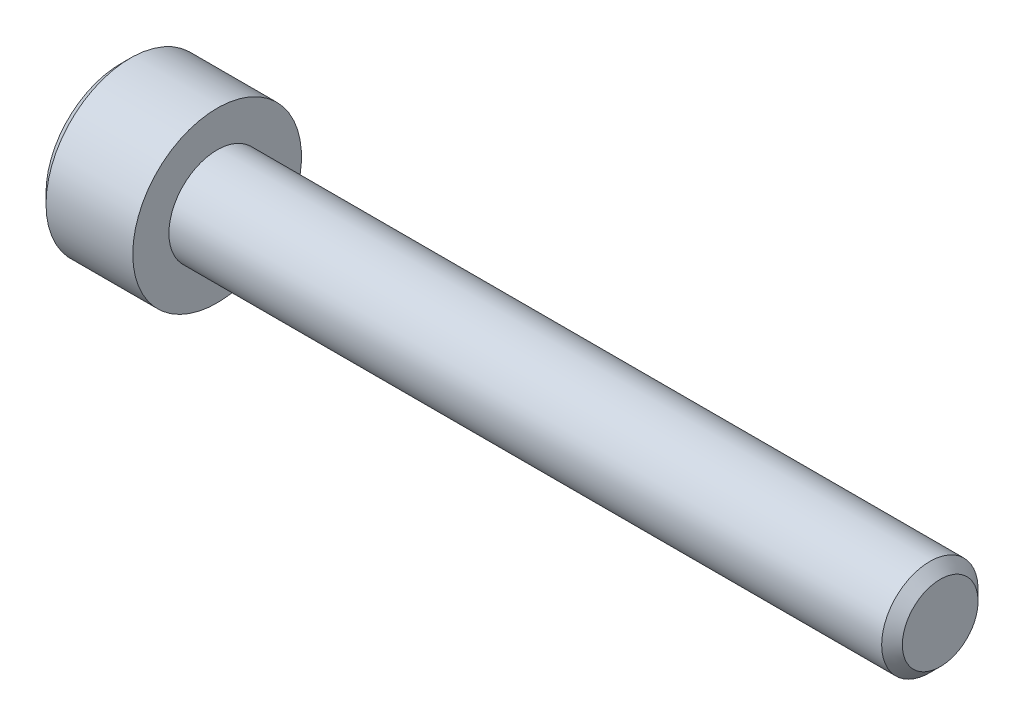
ISO-10303-21;
HEADER;
FILE_DESCRIPTION(('STEP AP214'),'2;1');
FILE_NAME('part.step','',(''),(''),'','','');
FILE_SCHEMA(('AUTOMOTIVE_DESIGN { 1 0 10303 214 1 1 1 1 }'));
ENDSEC;
DATA;
#1=APPLICATION_CONTEXT('core data for automotive mechanical design processes');
#2=APPLICATION_PROTOCOL_DEFINITION('international standard','automotive_design',2000,#1);
#3=PRODUCT_CONTEXT('',#1,'mechanical');
#4=PRODUCT('Part','Part','',(#3));
#5=PRODUCT_RELATED_PRODUCT_CATEGORY('part','',(#4));
#6=PRODUCT_DEFINITION_FORMATION('','',#4);
#7=PRODUCT_DEFINITION_CONTEXT('part definition',#1,'design');
#8=PRODUCT_DEFINITION('design','',#6,#7);
#9=PRODUCT_DEFINITION_SHAPE('','',#8);
#10=(LENGTH_UNIT() NAMED_UNIT(*) SI_UNIT(.MILLI.,.METRE.));
#11=(NAMED_UNIT(*) PLANE_ANGLE_UNIT() SI_UNIT($,.RADIAN.));
#12=(NAMED_UNIT(*) SI_UNIT($,.STERADIAN.) SOLID_ANGLE_UNIT());
#13=UNCERTAINTY_MEASURE_WITH_UNIT(LENGTH_MEASURE(1.E-05),#10,'distance_accuracy_value','');
#14=(GEOMETRIC_REPRESENTATION_CONTEXT(3) GLOBAL_UNCERTAINTY_ASSIGNED_CONTEXT((#13)) GLOBAL_UNIT_ASSIGNED_CONTEXT((#10,
#11,#12)) REPRESENTATION_CONTEXT('',''));
#15=CARTESIAN_POINT('',(0.,0.,0.));
#16=DIRECTION('',(0.,0.,1.));
#17=DIRECTION('',(1.,0.,0.));
#18=AXIS2_PLACEMENT_3D('',#15,#16,#17);
#19=CARTESIAN_POINT('',(-4.,-3.10000000000001,0.));
#20=DIRECTION('',(-1.,0.,0.));
#21=DIRECTION('',(0.,0.,1.));
#22=AXIS2_PLACEMENT_3D('',#19,#20,#21);
#23=PLANE('',#22);
#24=DIRECTION('',(0.,0.5,-0.866025403784439));
#25=VECTOR('',#24,1.);
#26=CARTESIAN_POINT('',(-4.,0.866025403784439,1.5));
#27=LINE('',#26,#25);
#28=CARTESIAN_POINT('',(-4.,0.866025403784439,1.5));
#29=VERTEX_POINT('',#28);
#30=CARTESIAN_POINT('',(-4.,1.73205080756888,0.));
#31=VERTEX_POINT('',#30);
#32=EDGE_CURVE('E59',#29,#31,#27,.T.);
#33=ORIENTED_EDGE('',*,*,#32,.F.);
#34=DIRECTION('',(0.,1.,0.));
#35=VECTOR('',#34,1.);
#36=CARTESIAN_POINT('',(-4.,-0.86602540378444,1.5));
#37=LINE('',#36,#35);
#38=CARTESIAN_POINT('',(-4.,-0.86602540378444,1.5));
#39=VERTEX_POINT('',#38);
#40=EDGE_CURVE('E142',#39,#29,#37,.T.);
#41=ORIENTED_EDGE('',*,*,#40,.F.);
#42=DIRECTION('',(0.,0.5,0.866025403784439));
#43=VECTOR('',#42,1.);
#44=CARTESIAN_POINT('',(-4.,-1.73205080756888,0.));
#45=LINE('',#44,#43);
#46=CARTESIAN_POINT('',(-4.,-1.73205080756888,0.));
#47=VERTEX_POINT('',#46);
#48=EDGE_CURVE('E140',#47,#39,#45,.T.);
#49=ORIENTED_EDGE('',*,*,#48,.F.);
#50=DIRECTION('',(0.,-0.5,0.866025403784439));
#51=VECTOR('',#50,1.);
#52=CARTESIAN_POINT('',(-4.,-0.866025403784439,-1.5));
#53=LINE('',#52,#51);
#54=CARTESIAN_POINT('',(-4.,-0.866025403784439,-1.5));
#55=VERTEX_POINT('',#54);
#56=EDGE_CURVE('E107',#55,#47,#53,.T.);
#57=ORIENTED_EDGE('',*,*,#56,.F.);
#58=DIRECTION('',(0.,-1.,0.));
#59=VECTOR('',#58,1.);
#60=CARTESIAN_POINT('',(-4.,0.866025403784439,-1.5));
#61=LINE('',#60,#59);
#62=CARTESIAN_POINT('',(-4.,0.866025403784439,-1.5));
#63=VERTEX_POINT('',#62);
#64=EDGE_CURVE('E136',#63,#55,#61,.T.);
#65=ORIENTED_EDGE('',*,*,#64,.F.);
#66=DIRECTION('',(0.,-0.5,-0.866025403784439));
#67=VECTOR('',#66,1.);
#68=CARTESIAN_POINT('',(-4.,1.73205080756888,0.));
#69=LINE('',#68,#67);
#70=EDGE_CURVE('E133',#31,#63,#69,.T.);
#71=ORIENTED_EDGE('',*,*,#70,.F.);
#72=EDGE_LOOP('',(#33,#41,#49,#57,#65,#71));
#73=FACE_BOUND('',#72,.T.);
#74=CARTESIAN_POINT('',(-4.,0.,0.));
#75=DIRECTION('',(-1.,0.,0.));
#76=DIRECTION('',(0.,0.,1.));
#77=AXIS2_PLACEMENT_3D('',#74,#75,#76);
#78=CIRCLE('',#77,3.10000000000001);
#79=CARTESIAN_POINT('',(-4.,0.,3.10000000000001));
#80=VERTEX_POINT('',#79);
#81=EDGE_CURVE('E146',#80,#80,#78,.T.);
#82=ORIENTED_EDGE('',*,*,#81,.T.);
#83=EDGE_LOOP('',(#82));
#84=FACE_BOUND('',#83,.T.);
#85=ADVANCED_FACE('F45',(#73,#84),#23,.T.);
#86=CARTESIAN_POINT('',(30.,0.,0.));
#87=DIRECTION('',(1.,0.,0.));
#88=DIRECTION('',(0.,0.,-1.));
#89=AXIS2_PLACEMENT_3D('',#86,#87,#88);
#90=PLANE('',#89);
#91=CARTESIAN_POINT('',(30.,0.,0.));
#92=DIRECTION('',(-1.,0.,0.));
#93=DIRECTION('',(0.,0.,1.));
#94=AXIS2_PLACEMENT_3D('',#91,#92,#93);
#95=CIRCLE('',#94,1.5705);
#96=CARTESIAN_POINT('',(30.,0.,1.5705));
#97=VERTEX_POINT('',#96);
#98=EDGE_CURVE('E11',#97,#97,#95,.T.);
#99=ORIENTED_EDGE('',*,*,#98,.F.);
#100=EDGE_LOOP('',(#99));
#101=FACE_BOUND('',#100,.T.);
#102=ADVANCED_FACE('F170',(#101),#90,.T.);
#103=CARTESIAN_POINT('',(29.5705,0.,0.));
#104=DIRECTION('',(-1.,0.,0.));
#105=DIRECTION('',(0.,0.,1.));
#106=AXIS2_PLACEMENT_3D('',#103,#104,#105);
#107=CONICAL_SURFACE('',#106,2.,0.785398163397457);
#108=ORIENTED_EDGE('',*,*,#98,.T.);
#109=EDGE_LOOP('',(#108));
#110=FACE_BOUND('',#109,.T.);
#111=CARTESIAN_POINT('',(29.5705,0.,0.));
#112=DIRECTION('',(-1.,0.,0.));
#113=DIRECTION('',(0.,0.,1.));
#114=AXIS2_PLACEMENT_3D('',#111,#112,#113);
#115=CIRCLE('',#114,2.);
#116=CARTESIAN_POINT('',(29.5705,0.,2.));
#117=VERTEX_POINT('',#116);
#118=EDGE_CURVE('E52',#117,#117,#115,.T.);
#119=ORIENTED_EDGE('',*,*,#118,.F.);
#120=EDGE_LOOP('',(#119));
#121=FACE_BOUND('',#120,.T.);
#122=ADVANCED_FACE('F168',(#110,#121),#107,.T.);
#123=CARTESIAN_POINT('',(-5.7,0.,0.));
#124=DIRECTION('',(-1.,0.,0.));
#125=DIRECTION('',(0.,0.,1.));
#126=AXIS2_PLACEMENT_3D('',#123,#124,#125);
#127=CYLINDRICAL_SURFACE('',#126,2.);
#128=ORIENTED_EDGE('',*,*,#118,.T.);
#129=EDGE_LOOP('',(#128));
#130=FACE_BOUND('',#129,.T.);
#131=CARTESIAN_POINT('',(0.,0.,0.));
#132=DIRECTION('',(-1.,0.,0.));
#133=DIRECTION('',(0.,0.,1.));
#134=AXIS2_PLACEMENT_3D('',#131,#132,#133);
#135=CIRCLE('',#134,2.);
#136=CARTESIAN_POINT('',(0.,0.,2.));
#137=VERTEX_POINT('',#136);
#138=EDGE_CURVE('E160',#137,#137,#135,.T.);
#139=ORIENTED_EDGE('',*,*,#138,.F.);
#140=EDGE_LOOP('',(#139));
#141=FACE_BOUND('',#140,.T.);
#142=ADVANCED_FACE('F165',(#130,#141),#127,.T.);
#143=CARTESIAN_POINT('',(0.,-2.,0.));
#144=DIRECTION('',(1.,0.,0.));
#145=DIRECTION('',(0.,0.,-1.));
#146=AXIS2_PLACEMENT_3D('',#143,#144,#145);
#147=PLANE('',#146);
#148=ORIENTED_EDGE('',*,*,#138,.T.);
#149=EDGE_LOOP('',(#148));
#150=FACE_BOUND('',#149,.T.);
#151=CARTESIAN_POINT('',(0.,0.,0.));
#152=DIRECTION('',(-1.,0.,0.));
#153=DIRECTION('',(0.,0.,1.));
#154=AXIS2_PLACEMENT_3D('',#151,#152,#153);
#155=CIRCLE('',#154,3.5);
#156=CARTESIAN_POINT('',(0.,0.,3.5));
#157=VERTEX_POINT('',#156);
#158=EDGE_CURVE('E157',#157,#157,#155,.T.);
#159=ORIENTED_EDGE('',*,*,#158,.F.);
#160=EDGE_LOOP('',(#159));
#161=FACE_BOUND('',#160,.T.);
#162=ADVANCED_FACE('F178',(#150,#161),#147,.T.);
#163=CARTESIAN_POINT('',(-5.7,0.,0.));
#164=DIRECTION('',(-1.,0.,0.));
#165=DIRECTION('',(0.,0.,1.));
#166=AXIS2_PLACEMENT_3D('',#163,#164,#165);
#167=CYLINDRICAL_SURFACE('',#166,3.5);
#168=ORIENTED_EDGE('',*,*,#158,.T.);
#169=EDGE_LOOP('',(#168));
#170=FACE_BOUND('',#169,.T.);
#171=CARTESIAN_POINT('',(-3.6,0.,0.));
#172=DIRECTION('',(-1.,0.,0.));
#173=DIRECTION('',(0.,0.,1.));
#174=AXIS2_PLACEMENT_3D('',#171,#172,#173);
#175=CIRCLE('',#174,3.5);
#176=CARTESIAN_POINT('',(-3.6,0.,3.5));
#177=VERTEX_POINT('',#176);
#178=EDGE_CURVE('E154',#177,#177,#175,.T.);
#179=ORIENTED_EDGE('',*,*,#178,.F.);
#180=EDGE_LOOP('',(#179));
#181=FACE_BOUND('',#180,.T.);
#182=ADVANCED_FACE('F194',(#170,#181),#167,.T.);
#183=CARTESIAN_POINT('',(-4.,0.,0.));
#184=DIRECTION('',(1.,0.,0.));
#185=DIRECTION('',(0.,0.,-1.));
#186=AXIS2_PLACEMENT_3D('',#183,#184,#185);
#187=CONICAL_SURFACE('',#186,3.10000000000001,0.785398163397443);
#188=ORIENTED_EDGE('',*,*,#178,.T.);
#189=EDGE_LOOP('',(#188));
#190=FACE_BOUND('',#189,.T.);
#191=ORIENTED_EDGE('',*,*,#81,.F.);
#192=EDGE_LOOP('',(#191));
#193=FACE_BOUND('',#192,.T.);
#194=ADVANCED_FACE('F192',(#190,#193),#187,.T.);
#195=CARTESIAN_POINT('',(-2.,0.866025403784439,1.5));
#196=DIRECTION('',(0.,0.866025403784439,0.5));
#197=DIRECTION('',(0.,-0.5,0.866025403784439));
#198=AXIS2_PLACEMENT_3D('',#195,#196,#197);
#199=PLANE('',#198);
#200=ORIENTED_EDGE('',*,*,#32,.T.);
#201=DIRECTION('',(-1.,0.,0.));
#202=VECTOR('',#201,1.);
#203=CARTESIAN_POINT('',(-2.,1.73205080756888,0.));
#204=LINE('',#203,#202);
#205=CARTESIAN_POINT('',(-2.,1.73205080756888,0.));
#206=VERTEX_POINT('',#205);
#207=EDGE_CURVE('E89',#206,#31,#204,.T.);
#208=ORIENTED_EDGE('',*,*,#207,.F.);
#209=DIRECTION('',(0.,0.5,-0.866025403784439));
#210=VECTOR('',#209,1.);
#211=CARTESIAN_POINT('',(-2.,0.866025403784439,1.5));
#212=LINE('',#211,#210);
#213=CARTESIAN_POINT('',(-2.,0.866025403784439,1.5));
#214=VERTEX_POINT('',#213);
#215=EDGE_CURVE('E144',#214,#206,#212,.T.);
#216=ORIENTED_EDGE('',*,*,#215,.F.);
#217=DIRECTION('',(-1.,0.,0.));
#218=VECTOR('',#217,1.);
#219=CARTESIAN_POINT('',(-2.,0.866025403784439,1.5));
#220=LINE('',#219,#218);
#221=EDGE_CURVE('E67',#214,#29,#220,.T.);
#222=ORIENTED_EDGE('',*,*,#221,.T.);
#223=EDGE_LOOP('',(#200,#208,#216,#222));
#224=FACE_BOUND('',#223,.T.);
#225=ADVANCED_FACE('F193',(#224),#199,.F.);
#226=CARTESIAN_POINT('',(-2.,-0.86602540378444,1.5));
#227=DIRECTION('',(0.,0.,1.));
#228=DIRECTION('',(0.,-1.,0.));
#229=AXIS2_PLACEMENT_3D('',#226,#227,#228);
#230=PLANE('',#229);
#231=ORIENTED_EDGE('',*,*,#40,.T.);
#232=ORIENTED_EDGE('',*,*,#221,.F.);
#233=DIRECTION('',(0.,1.,0.));
#234=VECTOR('',#233,1.);
#235=CARTESIAN_POINT('',(-2.,-0.86602540378444,1.5));
#236=LINE('',#235,#234);
#237=CARTESIAN_POINT('',(-2.,-0.86602540378444,1.5));
#238=VERTEX_POINT('',#237);
#239=EDGE_CURVE('E119',#238,#214,#236,.T.);
#240=ORIENTED_EDGE('',*,*,#239,.F.);
#241=DIRECTION('',(-1.,0.,0.));
#242=VECTOR('',#241,1.);
#243=CARTESIAN_POINT('',(-2.,-0.86602540378444,1.5));
#244=LINE('',#243,#242);
#245=EDGE_CURVE('E111',#238,#39,#244,.T.);
#246=ORIENTED_EDGE('',*,*,#245,.T.);
#247=EDGE_LOOP('',(#231,#232,#240,#246));
#248=FACE_BOUND('',#247,.T.);
#249=ADVANCED_FACE('F200',(#248),#230,.F.);
#250=CARTESIAN_POINT('',(-2.,-1.73205080756888,0.));
#251=DIRECTION('',(0.,-0.866025403784439,0.5));
#252=DIRECTION('',(0.,-0.5,-0.866025403784439));
#253=AXIS2_PLACEMENT_3D('',#250,#251,#252);
#254=PLANE('',#253);
#255=ORIENTED_EDGE('',*,*,#48,.T.);
#256=ORIENTED_EDGE('',*,*,#245,.F.);
#257=DIRECTION('',(0.,0.5,0.866025403784439));
#258=VECTOR('',#257,1.);
#259=CARTESIAN_POINT('',(-2.,-1.73205080756888,0.));
#260=LINE('',#259,#258);
#261=CARTESIAN_POINT('',(-2.,-1.73205080756888,0.));
#262=VERTEX_POINT('',#261);
#263=EDGE_CURVE('E115',#262,#238,#260,.T.);
#264=ORIENTED_EDGE('',*,*,#263,.F.);
#265=DIRECTION('',(-1.,0.,0.));
#266=VECTOR('',#265,1.);
#267=CARTESIAN_POINT('',(-2.,-1.73205080756888,0.));
#268=LINE('',#267,#266);
#269=EDGE_CURVE('E100',#262,#47,#268,.T.);
#270=ORIENTED_EDGE('',*,*,#269,.T.);
#271=EDGE_LOOP('',(#255,#256,#264,#270));
#272=FACE_BOUND('',#271,.T.);
#273=ADVANCED_FACE('F116',(#272),#254,.F.);
#274=CARTESIAN_POINT('',(-2.,-0.866025403784439,-1.5));
#275=DIRECTION('',(0.,-0.866025403784439,-0.5));
#276=DIRECTION('',(0.,0.5,-0.866025403784439));
#277=AXIS2_PLACEMENT_3D('',#274,#275,#276);
#278=PLANE('',#277);
#279=ORIENTED_EDGE('',*,*,#56,.T.);
#280=ORIENTED_EDGE('',*,*,#269,.F.);
#281=DIRECTION('',(0.,-0.5,0.866025403784439));
#282=VECTOR('',#281,1.);
#283=CARTESIAN_POINT('',(-2.,-0.866025403784439,-1.5));
#284=LINE('',#283,#282);
#285=CARTESIAN_POINT('',(-2.,-0.866025403784439,-1.5));
#286=VERTEX_POINT('',#285);
#287=EDGE_CURVE('E104',#286,#262,#284,.T.);
#288=ORIENTED_EDGE('',*,*,#287,.F.);
#289=DIRECTION('',(-1.,0.,0.));
#290=VECTOR('',#289,1.);
#291=CARTESIAN_POINT('',(-2.,-0.866025403784439,-1.5));
#292=LINE('',#291,#290);
#293=EDGE_CURVE('E112',#286,#55,#292,.T.);
#294=ORIENTED_EDGE('',*,*,#293,.T.);
#295=EDGE_LOOP('',(#279,#280,#288,#294));
#296=FACE_BOUND('',#295,.T.);
#297=ADVANCED_FACE('F102',(#296),#278,.F.);
#298=CARTESIAN_POINT('',(-2.,0.866025403784439,-1.5));
#299=DIRECTION('',(0.,0.,-1.));
#300=DIRECTION('',(-1.,0.,0.));
#301=AXIS2_PLACEMENT_3D('',#298,#299,#300);
#302=PLANE('',#301);
#303=ORIENTED_EDGE('',*,*,#64,.T.);
#304=ORIENTED_EDGE('',*,*,#293,.F.);
#305=DIRECTION('',(0.,-1.,0.));
#306=VECTOR('',#305,1.);
#307=CARTESIAN_POINT('',(-2.,0.866025403784439,-1.5));
#308=LINE('',#307,#306);
#309=CARTESIAN_POINT('',(-2.,0.866025403784439,-1.5));
#310=VERTEX_POINT('',#309);
#311=EDGE_CURVE('E125',#310,#286,#308,.T.);
#312=ORIENTED_EDGE('',*,*,#311,.F.);
#313=DIRECTION('',(-1.,0.,0.));
#314=VECTOR('',#313,1.);
#315=CARTESIAN_POINT('',(-2.,0.866025403784439,-1.5));
#316=LINE('',#315,#314);
#317=EDGE_CURVE('E149',#310,#63,#316,.T.);
#318=ORIENTED_EDGE('',*,*,#317,.T.);
#319=EDGE_LOOP('',(#303,#304,#312,#318));
#320=FACE_BOUND('',#319,.T.);
#321=ADVANCED_FACE('F259',(#320),#302,.F.);
#322=CARTESIAN_POINT('',(-2.,1.73205080756888,0.));
#323=DIRECTION('',(0.,0.866025403784439,-0.5));
#324=DIRECTION('',(0.,0.5,0.866025403784439));
#325=AXIS2_PLACEMENT_3D('',#322,#323,#324);
#326=PLANE('',#325);
#327=ORIENTED_EDGE('',*,*,#70,.T.);
#328=ORIENTED_EDGE('',*,*,#317,.F.);
#329=DIRECTION('',(0.,-0.5,-0.866025403784439));
#330=VECTOR('',#329,1.);
#331=CARTESIAN_POINT('',(-2.,1.73205080756888,0.));
#332=LINE('',#331,#330);
#333=EDGE_CURVE('E127',#206,#310,#332,.T.);
#334=ORIENTED_EDGE('',*,*,#333,.F.);
#335=ORIENTED_EDGE('',*,*,#207,.T.);
#336=EDGE_LOOP('',(#327,#328,#334,#335));
#337=FACE_BOUND('',#336,.T.);
#338=ADVANCED_FACE('F268',(#337),#326,.F.);
#339=CARTESIAN_POINT('',(-2.,0.,0.));
#340=DIRECTION('',(-1.,0.,0.));
#341=DIRECTION('',(0.,0.,1.));
#342=AXIS2_PLACEMENT_3D('',#339,#340,#341);
#343=PLANE('',#342);
#344=ORIENTED_EDGE('',*,*,#215,.T.);
#345=ORIENTED_EDGE('',*,*,#333,.T.);
#346=ORIENTED_EDGE('',*,*,#311,.T.);
#347=ORIENTED_EDGE('',*,*,#287,.T.);
#348=ORIENTED_EDGE('',*,*,#263,.T.);
#349=ORIENTED_EDGE('',*,*,#239,.T.);
#350=EDGE_LOOP('',(#344,#345,#346,#347,#348,#349));
#351=FACE_BOUND('',#350,.T.);
#352=ADVANCED_FACE('F122',(#351),#343,.T.);
#353=CLOSED_SHELL('',(#85,#102,#122,#142,#162,#182,#194,#225,#249,#273,#297,#321,#338,#352));
#354=MANIFOLD_SOLID_BREP('B2',#353);
#355=ADVANCED_BREP_SHAPE_REPRESENTATION('',(#18,#354),#14);
#356=SHAPE_DEFINITION_REPRESENTATION(#9,#355);
ENDSEC;
END-ISO-10303-21;
